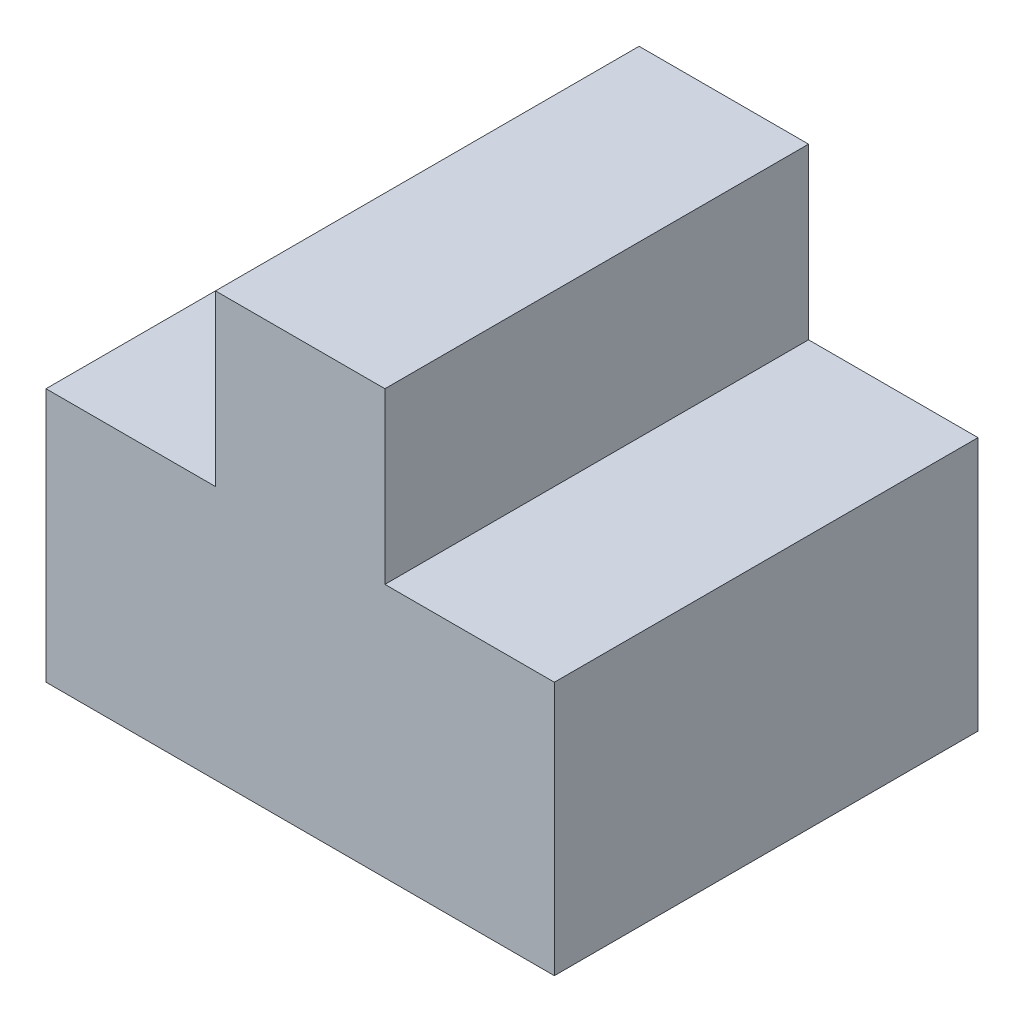
ISO-10303-21;
HEADER;
FILE_DESCRIPTION(('STEP AP214'),'2;1');
FILE_NAME('part.step','',(''),(''),'','','');
FILE_SCHEMA(('AUTOMOTIVE_DESIGN { 1 0 10303 214 1 1 1 1 }'));
ENDSEC;
DATA;
#1=APPLICATION_CONTEXT('core data for automotive mechanical design processes');
#2=APPLICATION_PROTOCOL_DEFINITION('international standard','automotive_design',2000,#1);
#3=PRODUCT_CONTEXT('',#1,'mechanical');
#4=PRODUCT('Part','Part','',(#3));
#5=PRODUCT_RELATED_PRODUCT_CATEGORY('part','',(#4));
#6=PRODUCT_DEFINITION_FORMATION('','',#4);
#7=PRODUCT_DEFINITION_CONTEXT('part definition',#1,'design');
#8=PRODUCT_DEFINITION('design','',#6,#7);
#9=PRODUCT_DEFINITION_SHAPE('','',#8);
#10=(LENGTH_UNIT() NAMED_UNIT(*) SI_UNIT(.MILLI.,.METRE.));
#11=(NAMED_UNIT(*) PLANE_ANGLE_UNIT() SI_UNIT($,.RADIAN.));
#12=(NAMED_UNIT(*) SI_UNIT($,.STERADIAN.) SOLID_ANGLE_UNIT());
#13=UNCERTAINTY_MEASURE_WITH_UNIT(LENGTH_MEASURE(1.E-05),#10,'distance_accuracy_value','');
#14=(GEOMETRIC_REPRESENTATION_CONTEXT(3) GLOBAL_UNCERTAINTY_ASSIGNED_CONTEXT((#13)) GLOBAL_UNIT_ASSIGNED_CONTEXT((#10,
#11,#12)) REPRESENTATION_CONTEXT('',''));
#15=CARTESIAN_POINT('',(0.,0.,0.));
#16=DIRECTION('',(0.,0.,1.));
#17=DIRECTION('',(1.,0.,0.));
#18=AXIS2_PLACEMENT_3D('',#15,#16,#17);
#19=CARTESIAN_POINT('',(0.,30.,50.));
#20=DIRECTION('',(1.,0.,0.));
#21=DIRECTION('',(0.,1.,0.));
#22=AXIS2_PLACEMENT_3D('',#19,#20,#21);
#23=PLANE('',#22);
#24=DIRECTION('',(0.,-1.,0.));
#25=VECTOR('',#24,1.);
#26=CARTESIAN_POINT('',(0.,30.,0.));
#27=LINE('',#26,#25);
#28=CARTESIAN_POINT('',(0.,30.,0.));
#29=VERTEX_POINT('',#28);
#30=CARTESIAN_POINT('',(0.,0.,0.));
#31=VERTEX_POINT('',#30);
#32=EDGE_CURVE('E138',#29,#31,#27,.T.);
#33=ORIENTED_EDGE('',*,*,#32,.T.);
#34=DIRECTION('',(0.,0.,-1.));
#35=VECTOR('',#34,1.);
#36=CARTESIAN_POINT('',(0.,0.,50.));
#37=LINE('',#36,#35);
#38=CARTESIAN_POINT('',(0.,0.,50.));
#39=VERTEX_POINT('',#38);
#40=EDGE_CURVE('E11',#39,#31,#37,.T.);
#41=ORIENTED_EDGE('',*,*,#40,.F.);
#42=DIRECTION('',(0.,-1.,0.));
#43=VECTOR('',#42,1.);
#44=CARTESIAN_POINT('',(0.,30.,50.));
#45=LINE('',#44,#43);
#46=CARTESIAN_POINT('',(0.,30.,50.));
#47=VERTEX_POINT('',#46);
#48=EDGE_CURVE('E160',#47,#39,#45,.T.);
#49=ORIENTED_EDGE('',*,*,#48,.F.);
#50=DIRECTION('',(0.,0.,-1.));
#51=VECTOR('',#50,1.);
#52=CARTESIAN_POINT('',(0.,30.,50.));
#53=LINE('',#52,#51);
#54=EDGE_CURVE('E134',#47,#29,#53,.T.);
#55=ORIENTED_EDGE('',*,*,#54,.T.);
#56=EDGE_LOOP('',(#33,#41,#49,#55));
#57=FACE_BOUND('',#56,.T.);
#58=ADVANCED_FACE('F37',(#57),#23,.F.);
#59=CARTESIAN_POINT('',(0.,0.,50.));
#60=DIRECTION('',(0.,1.,0.));
#61=DIRECTION('',(0.,0.,1.));
#62=AXIS2_PLACEMENT_3D('',#59,#60,#61);
#63=PLANE('',#62);
#64=DIRECTION('',(1.,0.,0.));
#65=VECTOR('',#64,1.);
#66=CARTESIAN_POINT('',(0.,0.,0.));
#67=LINE('',#66,#65);
#68=CARTESIAN_POINT('',(60.,0.,0.));
#69=VERTEX_POINT('',#68);
#70=EDGE_CURVE('E142',#31,#69,#67,.T.);
#71=ORIENTED_EDGE('',*,*,#70,.T.);
#72=DIRECTION('',(0.,0.,-1.));
#73=VECTOR('',#72,1.);
#74=CARTESIAN_POINT('',(60.,0.,50.));
#75=LINE('',#74,#73);
#76=CARTESIAN_POINT('',(60.,0.,50.));
#77=VERTEX_POINT('',#76);
#78=EDGE_CURVE('E46',#77,#69,#75,.T.);
#79=ORIENTED_EDGE('',*,*,#78,.F.);
#80=DIRECTION('',(1.,0.,0.));
#81=VECTOR('',#80,1.);
#82=CARTESIAN_POINT('',(0.,0.,50.));
#83=LINE('',#82,#81);
#84=EDGE_CURVE('E97',#39,#77,#83,.T.);
#85=ORIENTED_EDGE('',*,*,#84,.F.);
#86=ORIENTED_EDGE('',*,*,#40,.T.);
#87=EDGE_LOOP('',(#71,#79,#85,#86));
#88=FACE_BOUND('',#87,.T.);
#89=ADVANCED_FACE('F206',(#88),#63,.F.);
#90=CARTESIAN_POINT('',(60.,0.,50.));
#91=DIRECTION('',(-1.,0.,0.));
#92=DIRECTION('',(0.,-1.,0.));
#93=AXIS2_PLACEMENT_3D('',#90,#91,#92);
#94=PLANE('',#93);
#95=DIRECTION('',(0.,1.,0.));
#96=VECTOR('',#95,1.);
#97=CARTESIAN_POINT('',(60.,0.,0.));
#98=LINE('',#97,#96);
#99=CARTESIAN_POINT('',(60.,30.,0.));
#100=VERTEX_POINT('',#99);
#101=EDGE_CURVE('E145',#69,#100,#98,.T.);
#102=ORIENTED_EDGE('',*,*,#101,.T.);
#103=DIRECTION('',(0.,0.,-1.));
#104=VECTOR('',#103,1.);
#105=CARTESIAN_POINT('',(60.,30.,50.));
#106=LINE('',#105,#104);
#107=CARTESIAN_POINT('',(60.,30.,50.));
#108=VERTEX_POINT('',#107);
#109=EDGE_CURVE('E171',#108,#100,#106,.T.);
#110=ORIENTED_EDGE('',*,*,#109,.F.);
#111=DIRECTION('',(0.,1.,0.));
#112=VECTOR('',#111,1.);
#113=CARTESIAN_POINT('',(60.,0.,50.));
#114=LINE('',#113,#112);
#115=EDGE_CURVE('E181',#77,#108,#114,.T.);
#116=ORIENTED_EDGE('',*,*,#115,.F.);
#117=ORIENTED_EDGE('',*,*,#78,.T.);
#118=EDGE_LOOP('',(#102,#110,#116,#117));
#119=FACE_BOUND('',#118,.T.);
#120=ADVANCED_FACE('F179',(#119),#94,.F.);
#121=CARTESIAN_POINT('',(60.,30.,50.));
#122=DIRECTION('',(0.,-1.,0.));
#123=DIRECTION('',(1.,0.,0.));
#124=AXIS2_PLACEMENT_3D('',#121,#122,#123);
#125=PLANE('',#124);
#126=DIRECTION('',(-1.,0.,0.));
#127=VECTOR('',#126,1.);
#128=CARTESIAN_POINT('',(60.,30.,0.));
#129=LINE('',#128,#127);
#130=CARTESIAN_POINT('',(40.,30.,0.));
#131=VERTEX_POINT('',#130);
#132=EDGE_CURVE('E148',#100,#131,#129,.T.);
#133=ORIENTED_EDGE('',*,*,#132,.T.);
#134=DIRECTION('',(0.,0.,-1.));
#135=VECTOR('',#134,1.);
#136=CARTESIAN_POINT('',(40.,30.,50.));
#137=LINE('',#136,#135);
#138=CARTESIAN_POINT('',(40.,30.,50.));
#139=VERTEX_POINT('',#138);
#140=EDGE_CURVE('E167',#139,#131,#137,.T.);
#141=ORIENTED_EDGE('',*,*,#140,.F.);
#142=DIRECTION('',(-1.,0.,0.));
#143=VECTOR('',#142,1.);
#144=CARTESIAN_POINT('',(60.,30.,50.));
#145=LINE('',#144,#143);
#146=EDGE_CURVE('E194',#108,#139,#145,.T.);
#147=ORIENTED_EDGE('',*,*,#146,.F.);
#148=ORIENTED_EDGE('',*,*,#109,.T.);
#149=EDGE_LOOP('',(#133,#141,#147,#148));
#150=FACE_BOUND('',#149,.T.);
#151=ADVANCED_FACE('F189',(#150),#125,.F.);
#152=CARTESIAN_POINT('',(40.,30.,50.));
#153=DIRECTION('',(-1.,0.,0.));
#154=DIRECTION('',(0.,-1.,0.));
#155=AXIS2_PLACEMENT_3D('',#152,#153,#154);
#156=PLANE('',#155);
#157=DIRECTION('',(0.,1.,0.));
#158=VECTOR('',#157,1.);
#159=CARTESIAN_POINT('',(40.,30.,0.));
#160=LINE('',#159,#158);
#161=CARTESIAN_POINT('',(40.,50.,0.));
#162=VERTEX_POINT('',#161);
#163=EDGE_CURVE('E151',#131,#162,#160,.T.);
#164=ORIENTED_EDGE('',*,*,#163,.T.);
#165=DIRECTION('',(0.,0.,-1.));
#166=VECTOR('',#165,1.);
#167=CARTESIAN_POINT('',(40.,50.,50.));
#168=LINE('',#167,#166);
#169=CARTESIAN_POINT('',(40.,50.,50.));
#170=VERTEX_POINT('',#169);
#171=EDGE_CURVE('E127',#170,#162,#168,.T.);
#172=ORIENTED_EDGE('',*,*,#171,.F.);
#173=DIRECTION('',(0.,1.,0.));
#174=VECTOR('',#173,1.);
#175=CARTESIAN_POINT('',(40.,30.,50.));
#176=LINE('',#175,#174);
#177=EDGE_CURVE('E116',#139,#170,#176,.T.);
#178=ORIENTED_EDGE('',*,*,#177,.F.);
#179=ORIENTED_EDGE('',*,*,#140,.T.);
#180=EDGE_LOOP('',(#164,#172,#178,#179));
#181=FACE_BOUND('',#180,.T.);
#182=ADVANCED_FACE('F192',(#181),#156,.F.);
#183=CARTESIAN_POINT('',(40.,50.,50.));
#184=DIRECTION('',(0.,-1.,0.));
#185=DIRECTION('',(1.,0.,0.));
#186=AXIS2_PLACEMENT_3D('',#183,#184,#185);
#187=PLANE('',#186);
#188=DIRECTION('',(-1.,0.,0.));
#189=VECTOR('',#188,1.);
#190=CARTESIAN_POINT('',(40.,50.,0.));
#191=LINE('',#190,#189);
#192=CARTESIAN_POINT('',(20.,50.,0.));
#193=VERTEX_POINT('',#192);
#194=EDGE_CURVE('E125',#162,#193,#191,.T.);
#195=ORIENTED_EDGE('',*,*,#194,.T.);
#196=DIRECTION('',(0.,0.,-1.));
#197=VECTOR('',#196,1.);
#198=CARTESIAN_POINT('',(20.,50.,50.));
#199=LINE('',#198,#197);
#200=CARTESIAN_POINT('',(20.,50.,50.));
#201=VERTEX_POINT('',#200);
#202=EDGE_CURVE('E122',#201,#193,#199,.T.);
#203=ORIENTED_EDGE('',*,*,#202,.F.);
#204=DIRECTION('',(-1.,0.,0.));
#205=VECTOR('',#204,1.);
#206=CARTESIAN_POINT('',(40.,50.,50.));
#207=LINE('',#206,#205);
#208=EDGE_CURVE('E110',#170,#201,#207,.T.);
#209=ORIENTED_EDGE('',*,*,#208,.F.);
#210=ORIENTED_EDGE('',*,*,#171,.T.);
#211=EDGE_LOOP('',(#195,#203,#209,#210));
#212=FACE_BOUND('',#211,.T.);
#213=ADVANCED_FACE('F123',(#212),#187,.F.);
#214=CARTESIAN_POINT('',(20.,50.,50.));
#215=DIRECTION('',(1.,0.,0.));
#216=DIRECTION('',(0.,1.,0.));
#217=AXIS2_PLACEMENT_3D('',#214,#215,#216);
#218=PLANE('',#217);
#219=DIRECTION('',(0.,-1.,0.));
#220=VECTOR('',#219,1.);
#221=CARTESIAN_POINT('',(20.,50.,0.));
#222=LINE('',#221,#220);
#223=CARTESIAN_POINT('',(20.,30.,0.));
#224=VERTEX_POINT('',#223);
#225=EDGE_CURVE('E83',#193,#224,#222,.T.);
#226=ORIENTED_EDGE('',*,*,#225,.T.);
#227=DIRECTION('',(0.,0.,-1.));
#228=VECTOR('',#227,1.);
#229=CARTESIAN_POINT('',(20.,30.,50.));
#230=LINE('',#229,#228);
#231=CARTESIAN_POINT('',(20.,30.,50.));
#232=VERTEX_POINT('',#231);
#233=EDGE_CURVE('E128',#232,#224,#230,.T.);
#234=ORIENTED_EDGE('',*,*,#233,.F.);
#235=DIRECTION('',(0.,-1.,0.));
#236=VECTOR('',#235,1.);
#237=CARTESIAN_POINT('',(20.,50.,50.));
#238=LINE('',#237,#236);
#239=EDGE_CURVE('E114',#201,#232,#238,.T.);
#240=ORIENTED_EDGE('',*,*,#239,.F.);
#241=ORIENTED_EDGE('',*,*,#202,.T.);
#242=EDGE_LOOP('',(#226,#234,#240,#241));
#243=FACE_BOUND('',#242,.T.);
#244=ADVANCED_FACE('F130',(#243),#218,.F.);
#245=CARTESIAN_POINT('',(20.,30.,50.));
#246=DIRECTION('',(0.,-1.,0.));
#247=DIRECTION('',(0.,0.,-1.));
#248=AXIS2_PLACEMENT_3D('',#245,#246,#247);
#249=PLANE('',#248);
#250=DIRECTION('',(-1.,0.,0.));
#251=VECTOR('',#250,1.);
#252=CARTESIAN_POINT('',(20.,30.,0.));
#253=LINE('',#252,#251);
#254=EDGE_CURVE('E89',#224,#29,#253,.T.);
#255=ORIENTED_EDGE('',*,*,#254,.T.);
#256=ORIENTED_EDGE('',*,*,#54,.F.);
#257=DIRECTION('',(-1.,0.,0.));
#258=VECTOR('',#257,1.);
#259=CARTESIAN_POINT('',(20.,30.,50.));
#260=LINE('',#259,#258);
#261=EDGE_CURVE('E54',#232,#47,#260,.T.);
#262=ORIENTED_EDGE('',*,*,#261,.F.);
#263=ORIENTED_EDGE('',*,*,#233,.T.);
#264=EDGE_LOOP('',(#255,#256,#262,#263));
#265=FACE_BOUND('',#264,.T.);
#266=ADVANCED_FACE('F222',(#265),#249,.F.);
#267=CARTESIAN_POINT('',(0.,0.,50.));
#268=DIRECTION('',(0.,0.,1.));
#269=DIRECTION('',(1.,0.,0.));
#270=AXIS2_PLACEMENT_3D('',#267,#268,#269);
#271=PLANE('',#270);
#272=ORIENTED_EDGE('',*,*,#48,.T.);
#273=ORIENTED_EDGE('',*,*,#84,.T.);
#274=ORIENTED_EDGE('',*,*,#115,.T.);
#275=ORIENTED_EDGE('',*,*,#146,.T.);
#276=ORIENTED_EDGE('',*,*,#177,.T.);
#277=ORIENTED_EDGE('',*,*,#208,.T.);
#278=ORIENTED_EDGE('',*,*,#239,.T.);
#279=ORIENTED_EDGE('',*,*,#261,.T.);
#280=EDGE_LOOP('',(#272,#273,#274,#275,#276,#277,#278,#279));
#281=FACE_BOUND('',#280,.T.);
#282=ADVANCED_FACE('F112',(#281),#271,.T.);
#283=CARTESIAN_POINT('',(0.,0.,0.));
#284=DIRECTION('',(0.,0.,1.));
#285=DIRECTION('',(1.,0.,0.));
#286=AXIS2_PLACEMENT_3D('',#283,#284,#285);
#287=PLANE('',#286);
#288=ORIENTED_EDGE('',*,*,#32,.F.);
#289=ORIENTED_EDGE('',*,*,#254,.F.);
#290=ORIENTED_EDGE('',*,*,#225,.F.);
#291=ORIENTED_EDGE('',*,*,#194,.F.);
#292=ORIENTED_EDGE('',*,*,#163,.F.);
#293=ORIENTED_EDGE('',*,*,#132,.F.);
#294=ORIENTED_EDGE('',*,*,#101,.F.);
#295=ORIENTED_EDGE('',*,*,#70,.F.);
#296=EDGE_LOOP('',(#288,#289,#290,#291,#292,#293,#294,#295));
#297=FACE_BOUND('',#296,.T.);
#298=ADVANCED_FACE('F185',(#297),#287,.F.);
#299=CLOSED_SHELL('',(#58,#89,#120,#151,#182,#213,#244,#266,#282,#298));
#300=MANIFOLD_SOLID_BREP('B2',#299);
#301=ADVANCED_BREP_SHAPE_REPRESENTATION('',(#18,#300),#14);
#302=SHAPE_DEFINITION_REPRESENTATION(#9,#301);
ENDSEC;
END-ISO-10303-21;
